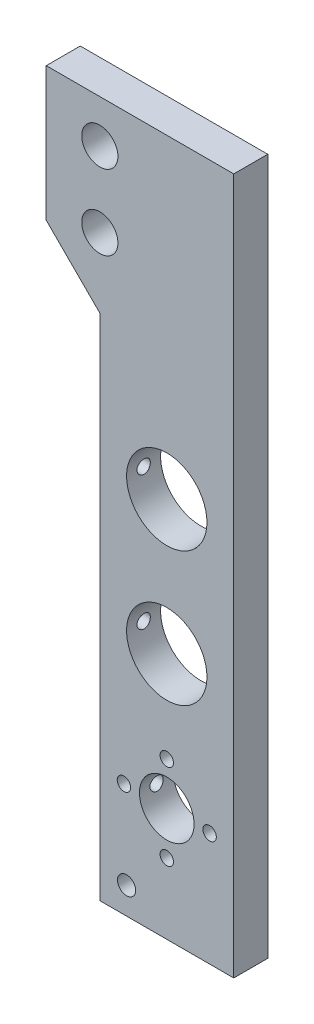
ISO-10303-21;
HEADER;
FILE_DESCRIPTION(('STEP AP214'),'2;1');
FILE_NAME('part.step','',(''),(''),'','','');
FILE_SCHEMA(('AUTOMOTIVE_DESIGN { 1 0 10303 214 1 1 1 1 }'));
ENDSEC;
DATA;
#1=APPLICATION_CONTEXT('core data for automotive mechanical design processes');
#2=APPLICATION_PROTOCOL_DEFINITION('international standard','automotive_design',2000,#1);
#3=PRODUCT_CONTEXT('',#1,'mechanical');
#4=PRODUCT('Part','Part','',(#3));
#5=PRODUCT_RELATED_PRODUCT_CATEGORY('part','',(#4));
#6=PRODUCT_DEFINITION_FORMATION('','',#4);
#7=PRODUCT_DEFINITION_CONTEXT('part definition',#1,'design');
#8=PRODUCT_DEFINITION('design','',#6,#7);
#9=PRODUCT_DEFINITION_SHAPE('','',#8);
#10=(LENGTH_UNIT() NAMED_UNIT(*) SI_UNIT(.MILLI.,.METRE.));
#11=(NAMED_UNIT(*) PLANE_ANGLE_UNIT() SI_UNIT($,.RADIAN.));
#12=(NAMED_UNIT(*) SI_UNIT($,.STERADIAN.) SOLID_ANGLE_UNIT());
#13=UNCERTAINTY_MEASURE_WITH_UNIT(LENGTH_MEASURE(1.E-05),#10,'distance_accuracy_value','');
#14=(GEOMETRIC_REPRESENTATION_CONTEXT(3) GLOBAL_UNCERTAINTY_ASSIGNED_CONTEXT((#13)) GLOBAL_UNIT_ASSIGNED_CONTEXT((#10,
#11,#12)) REPRESENTATION_CONTEXT('',''));
#15=CARTESIAN_POINT('',(0.,0.,0.));
#16=DIRECTION('',(0.,0.,1.));
#17=DIRECTION('',(1.,0.,0.));
#18=AXIS2_PLACEMENT_3D('',#15,#16,#17);
#19=CARTESIAN_POINT('',(0.,0.,6.35));
#20=DIRECTION('',(0.,0.,-1.));
#21=DIRECTION('',(-1.,0.,0.));
#22=AXIS2_PLACEMENT_3D('',#19,#20,#21);
#23=PLANE('',#22);
#24=CARTESIAN_POINT('',(-7.5,-16.15,6.35));
#25=DIRECTION('',(0.,0.,1.));
#26=DIRECTION('',(1.,0.,0.));
#27=AXIS2_PLACEMENT_3D('',#24,#25,#26);
#28=CIRCLE('',#27,1.69999999999999);
#29=CARTESIAN_POINT('',(-5.80000000000001,-16.15,6.35));
#30=VERTEX_POINT('',#29);
#31=EDGE_CURVE('E265',#30,#30,#28,.T.);
#32=ORIENTED_EDGE('',*,*,#31,.F.);
#33=EDGE_LOOP('',(#32));
#34=FACE_BOUND('',#33,.T.);
#35=CARTESIAN_POINT('',(0.,8.,6.35));
#36=DIRECTION('',(0.,0.,1.));
#37=DIRECTION('',(1.,0.,0.));
#38=AXIS2_PLACEMENT_3D('',#35,#36,#37);
#39=CIRCLE('',#38,1.25);
#40=CARTESIAN_POINT('',(1.25,8.,6.35));
#41=VERTEX_POINT('',#40);
#42=EDGE_CURVE('E259',#41,#41,#39,.T.);
#43=ORIENTED_EDGE('',*,*,#42,.F.);
#44=EDGE_LOOP('',(#43));
#45=FACE_BOUND('',#44,.T.);
#46=CARTESIAN_POINT('',(8.,0.,6.35));
#47=DIRECTION('',(0.,0.,1.));
#48=DIRECTION('',(1.,0.,0.));
#49=AXIS2_PLACEMENT_3D('',#46,#47,#48);
#50=CIRCLE('',#49,1.25);
#51=CARTESIAN_POINT('',(9.25,0.,6.35));
#52=VERTEX_POINT('',#51);
#53=EDGE_CURVE('E253',#52,#52,#50,.T.);
#54=ORIENTED_EDGE('',*,*,#53,.F.);
#55=EDGE_LOOP('',(#54));
#56=FACE_BOUND('',#55,.T.);
#57=CARTESIAN_POINT('',(0.,-8.,6.35));
#58=DIRECTION('',(0.,0.,1.));
#59=DIRECTION('',(1.,0.,0.));
#60=AXIS2_PLACEMENT_3D('',#57,#58,#59);
#61=CIRCLE('',#60,1.25);
#62=CARTESIAN_POINT('',(1.25,-8.,6.35));
#63=VERTEX_POINT('',#62);
#64=EDGE_CURVE('E247',#63,#63,#61,.T.);
#65=ORIENTED_EDGE('',*,*,#64,.F.);
#66=EDGE_LOOP('',(#65));
#67=FACE_BOUND('',#66,.T.);
#68=CARTESIAN_POINT('',(-12.5,86.85,6.35));
#69=DIRECTION('',(0.,0.,1.));
#70=DIRECTION('',(1.,0.,0.));
#71=AXIS2_PLACEMENT_3D('',#68,#69,#70);
#72=CIRCLE('',#71,3.3782);
#73=CARTESIAN_POINT('',(-9.1218,86.85,6.35));
#74=VERTEX_POINT('',#73);
#75=EDGE_CURVE('E235',#74,#74,#72,.T.);
#76=ORIENTED_EDGE('',*,*,#75,.F.);
#77=EDGE_LOOP('',(#76));
#78=FACE_BOUND('',#77,.T.);
#79=DIRECTION('',(-1.,0.,0.));
#80=VECTOR('',#79,1.);
#81=CARTESIAN_POINT('',(-12.5,108.85,6.35));
#82=LINE('',#81,#80);
#83=CARTESIAN_POINT('',(12.5,108.85,6.35));
#84=VERTEX_POINT('',#83);
#85=CARTESIAN_POINT('',(-22.5,108.85,6.35));
#86=VERTEX_POINT('',#85);
#87=EDGE_CURVE('E172',#84,#86,#82,.T.);
#88=ORIENTED_EDGE('',*,*,#87,.T.);
#89=DIRECTION('',(0.,-1.,0.));
#90=VECTOR('',#89,1.);
#91=CARTESIAN_POINT('',(-22.5,83.8500000000001,6.35));
#92=LINE('',#91,#90);
#93=CARTESIAN_POINT('',(-22.5,83.8500000000001,6.35));
#94=VERTEX_POINT('',#93);
#95=EDGE_CURVE('E213',#86,#94,#92,.T.);
#96=ORIENTED_EDGE('',*,*,#95,.T.);
#97=DIRECTION('',(0.707106781186543,-0.707106781186552,0.));
#98=VECTOR('',#97,1.);
#99=CARTESIAN_POINT('',(-12.5,73.85,6.35));
#100=LINE('',#99,#98);
#101=CARTESIAN_POINT('',(-12.5,73.85,6.35));
#102=VERTEX_POINT('',#101);
#103=EDGE_CURVE('E211',#94,#102,#100,.T.);
#104=ORIENTED_EDGE('',*,*,#103,.T.);
#105=DIRECTION('',(0.,-1.,0.));
#106=VECTOR('',#105,1.);
#107=CARTESIAN_POINT('',(-12.5,-21.15,6.35));
#108=LINE('',#107,#106);
#109=CARTESIAN_POINT('',(-12.5,-21.15,6.35));
#110=VERTEX_POINT('',#109);
#111=EDGE_CURVE('E175',#102,#110,#108,.T.);
#112=ORIENTED_EDGE('',*,*,#111,.T.);
#113=DIRECTION('',(1.,0.,0.));
#114=VECTOR('',#113,1.);
#115=CARTESIAN_POINT('',(-12.5,-21.15,6.35));
#116=LINE('',#115,#114);
#117=CARTESIAN_POINT('',(12.5,-21.15,6.35));
#118=VERTEX_POINT('',#117);
#119=EDGE_CURVE('E186',#110,#118,#116,.T.);
#120=ORIENTED_EDGE('',*,*,#119,.T.);
#121=DIRECTION('',(0.,1.,0.));
#122=VECTOR('',#121,1.);
#123=CARTESIAN_POINT('',(12.5,-21.15,6.35));
#124=LINE('',#123,#122);
#125=EDGE_CURVE('E184',#118,#84,#124,.T.);
#126=ORIENTED_EDGE('',*,*,#125,.T.);
#127=EDGE_LOOP('',(#88,#96,#104,#112,#120,#126));
#128=FACE_BOUND('',#127,.T.);
#129=CARTESIAN_POINT('',(0.,0.,6.35));
#130=DIRECTION('',(0.,0.,1.));
#131=DIRECTION('',(1.,0.,0.));
#132=AXIS2_PLACEMENT_3D('',#129,#130,#131);
#133=CIRCLE('',#132,5.1);
#134=CARTESIAN_POINT('',(5.1,0.,6.35));
#135=VERTEX_POINT('',#134);
#136=EDGE_CURVE('E182',#135,#135,#133,.T.);
#137=ORIENTED_EDGE('',*,*,#136,.F.);
#138=EDGE_LOOP('',(#137));
#139=FACE_BOUND('',#138,.T.);
#140=CARTESIAN_POINT('',(0.,25.,6.35));
#141=DIRECTION('',(0.,0.,1.));
#142=DIRECTION('',(1.,0.,0.));
#143=AXIS2_PLACEMENT_3D('',#140,#141,#142);
#144=CIRCLE('',#143,7.5);
#145=CARTESIAN_POINT('',(7.5,25.,6.35));
#146=VERTEX_POINT('',#145);
#147=EDGE_CURVE('E192',#146,#146,#144,.T.);
#148=ORIENTED_EDGE('',*,*,#147,.F.);
#149=EDGE_LOOP('',(#148));
#150=FACE_BOUND('',#149,.T.);
#151=CARTESIAN_POINT('',(0.,50.,6.35));
#152=DIRECTION('',(0.,0.,1.));
#153=DIRECTION('',(1.,0.,0.));
#154=AXIS2_PLACEMENT_3D('',#151,#152,#153);
#155=CIRCLE('',#154,7.5);
#156=CARTESIAN_POINT('',(7.5,50.,6.35));
#157=VERTEX_POINT('',#156);
#158=EDGE_CURVE('E198',#157,#157,#155,.T.);
#159=ORIENTED_EDGE('',*,*,#158,.F.);
#160=EDGE_LOOP('',(#159));
#161=FACE_BOUND('',#160,.T.);
#162=CARTESIAN_POINT('',(-12.5,100.85,6.35));
#163=DIRECTION('',(0.,0.,1.));
#164=DIRECTION('',(1.,0.,0.));
#165=AXIS2_PLACEMENT_3D('',#162,#163,#164);
#166=CIRCLE('',#165,3.3782);
#167=CARTESIAN_POINT('',(-9.1218,100.85,6.35));
#168=VERTEX_POINT('',#167);
#169=EDGE_CURVE('E229',#168,#168,#166,.T.);
#170=ORIENTED_EDGE('',*,*,#169,.F.);
#171=EDGE_LOOP('',(#170));
#172=FACE_BOUND('',#171,.T.);
#173=CARTESIAN_POINT('',(-8.,0.,6.35));
#174=DIRECTION('',(0.,0.,1.));
#175=DIRECTION('',(1.,0.,0.));
#176=AXIS2_PLACEMENT_3D('',#173,#174,#175);
#177=CIRCLE('',#176,1.25);
#178=CARTESIAN_POINT('',(-6.75,0.,6.35));
#179=VERTEX_POINT('',#178);
#180=EDGE_CURVE('E241',#179,#179,#177,.T.);
#181=ORIENTED_EDGE('',*,*,#180,.F.);
#182=EDGE_LOOP('',(#181));
#183=FACE_BOUND('',#182,.T.);
#184=ADVANCED_FACE('F45',(#34,#45,#56,#67,#78,#128,#139,#150,#161,#172,#183),#23,.F.);
#185=CARTESIAN_POINT('',(-12.5,0.,3.175));
#186=DIRECTION('',(-1.,0.,0.));
#187=DIRECTION('',(0.,0.,1.));
#188=AXIS2_PLACEMENT_3D('',#185,#186,#187);
#189=CYLINDRICAL_SURFACE('',#188,1.24999999999999);
#190=CARTESIAN_POINT('',(-12.5,0.,3.175));
#191=DIRECTION('',(-1.,0.,0.));
#192=DIRECTION('',(0.,0.,1.));
#193=AXIS2_PLACEMENT_3D('',#190,#191,#192);
#194=CIRCLE('',#193,1.24999999999999);
#195=CARTESIAN_POINT('',(-12.5,0.,4.42499999999999));
#196=VERTEX_POINT('',#195);
#197=EDGE_CURVE('E127',#196,#196,#194,.T.);
#198=ORIENTED_EDGE('',*,*,#197,.T.);
#199=EDGE_LOOP('',(#198));
#200=FACE_BOUND('',#199,.T.);
#201=CARTESIAN_POINT('',(-8.,0.,3.175));
#202=DIRECTION('',(-0.707106781186547,0.,-0.707106781186547));
#203=DIRECTION('',(-0.707106781186547,0.,0.707106781186547));
#204=AXIS2_PLACEMENT_3D('',#201,#202,#203);
#205=ELLIPSE('',#204,1.76776695296636,1.25);
#206=CARTESIAN_POINT('',(-8.,1.25,3.175));
#207=VERTEX_POINT('',#206);
#208=CARTESIAN_POINT('',(-8.,-1.25,3.175));
#209=VERTEX_POINT('',#208);
#210=EDGE_CURVE('E58',#207,#209,#205,.F.);
#211=ORIENTED_EDGE('',*,*,#210,.T.);
#212=CARTESIAN_POINT('',(-8.,0.,3.175));
#213=DIRECTION('',(-0.707106781186547,0.,0.707106781186547));
#214=DIRECTION('',(-0.707106781186547,0.,-0.707106781186547));
#215=AXIS2_PLACEMENT_3D('',#212,#213,#214);
#216=ELLIPSE('',#215,1.76776695296636,1.25);
#217=EDGE_CURVE('E11',#209,#207,#216,.F.);
#218=ORIENTED_EDGE('',*,*,#217,.T.);
#219=EDGE_LOOP('',(#211,#218));
#220=FACE_BOUND('',#219,.T.);
#221=ADVANCED_FACE('F114',(#200,#220),#189,.F.);
#222=CARTESIAN_POINT('',(0.,0.,0.));
#223=DIRECTION('',(0.,0.,-1.));
#224=DIRECTION('',(-1.,0.,0.));
#225=AXIS2_PLACEMENT_3D('',#222,#223,#224);
#226=PLANE('',#225);
#227=CARTESIAN_POINT('',(-7.5,-16.15,0.));
#228=DIRECTION('',(0.,0.,1.));
#229=DIRECTION('',(1.,0.,0.));
#230=AXIS2_PLACEMENT_3D('',#227,#228,#229);
#231=CIRCLE('',#230,1.7);
#232=CARTESIAN_POINT('',(-5.8,-16.15,0.));
#233=VERTEX_POINT('',#232);
#234=EDGE_CURVE('E262',#233,#233,#231,.T.);
#235=ORIENTED_EDGE('',*,*,#234,.T.);
#236=EDGE_LOOP('',(#235));
#237=FACE_BOUND('',#236,.T.);
#238=CARTESIAN_POINT('',(0.,8.,0.));
#239=DIRECTION('',(0.,0.,1.));
#240=DIRECTION('',(1.,0.,0.));
#241=AXIS2_PLACEMENT_3D('',#238,#239,#240);
#242=CIRCLE('',#241,1.25);
#243=CARTESIAN_POINT('',(1.25,8.,0.));
#244=VERTEX_POINT('',#243);
#245=EDGE_CURVE('E256',#244,#244,#242,.T.);
#246=ORIENTED_EDGE('',*,*,#245,.T.);
#247=EDGE_LOOP('',(#246));
#248=FACE_BOUND('',#247,.T.);
#249=CARTESIAN_POINT('',(8.,0.,0.));
#250=DIRECTION('',(0.,0.,1.));
#251=DIRECTION('',(1.,0.,0.));
#252=AXIS2_PLACEMENT_3D('',#249,#250,#251);
#253=CIRCLE('',#252,1.25);
#254=CARTESIAN_POINT('',(9.25,0.,0.));
#255=VERTEX_POINT('',#254);
#256=EDGE_CURVE('E250',#255,#255,#253,.T.);
#257=ORIENTED_EDGE('',*,*,#256,.T.);
#258=EDGE_LOOP('',(#257));
#259=FACE_BOUND('',#258,.T.);
#260=CARTESIAN_POINT('',(0.,-8.,0.));
#261=DIRECTION('',(0.,0.,1.));
#262=DIRECTION('',(1.,0.,0.));
#263=AXIS2_PLACEMENT_3D('',#260,#261,#262);
#264=CIRCLE('',#263,1.25);
#265=CARTESIAN_POINT('',(1.25,-8.,0.));
#266=VERTEX_POINT('',#265);
#267=EDGE_CURVE('E244',#266,#266,#264,.T.);
#268=ORIENTED_EDGE('',*,*,#267,.T.);
#269=EDGE_LOOP('',(#268));
#270=FACE_BOUND('',#269,.T.);
#271=CARTESIAN_POINT('',(-8.,0.,0.));
#272=DIRECTION('',(0.,0.,1.));
#273=DIRECTION('',(1.,0.,0.));
#274=AXIS2_PLACEMENT_3D('',#271,#272,#273);
#275=CIRCLE('',#274,1.25);
#276=CARTESIAN_POINT('',(-6.75,0.,0.));
#277=VERTEX_POINT('',#276);
#278=EDGE_CURVE('E238',#277,#277,#275,.T.);
#279=ORIENTED_EDGE('',*,*,#278,.T.);
#280=EDGE_LOOP('',(#279));
#281=FACE_BOUND('',#280,.T.);
#282=CARTESIAN_POINT('',(-12.5,86.85,0.));
#283=DIRECTION('',(0.,0.,1.));
#284=DIRECTION('',(1.,0.,0.));
#285=AXIS2_PLACEMENT_3D('',#282,#283,#284);
#286=CIRCLE('',#285,3.3782);
#287=CARTESIAN_POINT('',(-9.1218,86.85,0.));
#288=VERTEX_POINT('',#287);
#289=EDGE_CURVE('E232',#288,#288,#286,.T.);
#290=ORIENTED_EDGE('',*,*,#289,.T.);
#291=EDGE_LOOP('',(#290));
#292=FACE_BOUND('',#291,.T.);
#293=CARTESIAN_POINT('',(-12.5,100.85,0.));
#294=DIRECTION('',(0.,0.,1.));
#295=DIRECTION('',(1.,0.,0.));
#296=AXIS2_PLACEMENT_3D('',#293,#294,#295);
#297=CIRCLE('',#296,3.3782);
#298=CARTESIAN_POINT('',(-9.1218,100.85,0.));
#299=VERTEX_POINT('',#298);
#300=EDGE_CURVE('E225',#299,#299,#297,.T.);
#301=ORIENTED_EDGE('',*,*,#300,.T.);
#302=EDGE_LOOP('',(#301));
#303=FACE_BOUND('',#302,.T.);
#304=CARTESIAN_POINT('',(0.,25.,0.));
#305=DIRECTION('',(0.,0.,1.));
#306=DIRECTION('',(1.,0.,0.));
#307=AXIS2_PLACEMENT_3D('',#304,#305,#306);
#308=CIRCLE('',#307,7.5);
#309=CARTESIAN_POINT('',(7.5,25.,0.));
#310=VERTEX_POINT('',#309);
#311=EDGE_CURVE('E195',#310,#310,#308,.T.);
#312=ORIENTED_EDGE('',*,*,#311,.T.);
#313=EDGE_LOOP('',(#312));
#314=FACE_BOUND('',#313,.T.);
#315=DIRECTION('',(0.,-1.,0.));
#316=VECTOR('',#315,1.);
#317=CARTESIAN_POINT('',(-12.5,-21.15,0.));
#318=LINE('',#317,#316);
#319=CARTESIAN_POINT('',(-12.5,73.85,0.));
#320=VERTEX_POINT('',#319);
#321=CARTESIAN_POINT('',(-12.5,-21.15,0.));
#322=VERTEX_POINT('',#321);
#323=EDGE_CURVE('E180',#320,#322,#318,.T.);
#324=ORIENTED_EDGE('',*,*,#323,.F.);
#325=DIRECTION('',(-0.707106781186543,0.707106781186552,0.));
#326=VECTOR('',#325,1.);
#327=CARTESIAN_POINT('',(-12.5,73.85,0.));
#328=LINE('',#327,#326);
#329=CARTESIAN_POINT('',(-22.5,83.8500000000001,0.));
#330=VERTEX_POINT('',#329);
#331=EDGE_CURVE('E66',#320,#330,#328,.T.);
#332=ORIENTED_EDGE('',*,*,#331,.T.);
#333=DIRECTION('',(0.,1.,0.));
#334=VECTOR('',#333,1.);
#335=CARTESIAN_POINT('',(-22.5,83.8500000000001,0.));
#336=LINE('',#335,#334);
#337=CARTESIAN_POINT('',(-22.5,108.85,0.));
#338=VERTEX_POINT('',#337);
#339=EDGE_CURVE('E217',#330,#338,#336,.T.);
#340=ORIENTED_EDGE('',*,*,#339,.T.);
#341=DIRECTION('',(-1.,0.,0.));
#342=VECTOR('',#341,1.);
#343=CARTESIAN_POINT('',(-12.5,108.85,0.));
#344=LINE('',#343,#342);
#345=CARTESIAN_POINT('',(12.5,108.85,0.));
#346=VERTEX_POINT('',#345);
#347=EDGE_CURVE('E173',#346,#338,#344,.T.);
#348=ORIENTED_EDGE('',*,*,#347,.F.);
#349=DIRECTION('',(0.,1.,0.));
#350=VECTOR('',#349,1.);
#351=CARTESIAN_POINT('',(12.5,-21.15,0.));
#352=LINE('',#351,#350);
#353=CARTESIAN_POINT('',(12.5,-21.15,0.));
#354=VERTEX_POINT('',#353);
#355=EDGE_CURVE('E176',#354,#346,#352,.T.);
#356=ORIENTED_EDGE('',*,*,#355,.F.);
#357=DIRECTION('',(1.,0.,0.));
#358=VECTOR('',#357,1.);
#359=CARTESIAN_POINT('',(-12.5,-21.15,0.));
#360=LINE('',#359,#358);
#361=EDGE_CURVE('E178',#322,#354,#360,.T.);
#362=ORIENTED_EDGE('',*,*,#361,.F.);
#363=EDGE_LOOP('',(#324,#332,#340,#348,#356,#362));
#364=FACE_BOUND('',#363,.T.);
#365=CARTESIAN_POINT('',(0.,0.,0.));
#366=DIRECTION('',(0.,0.,1.));
#367=DIRECTION('',(1.,0.,0.));
#368=AXIS2_PLACEMENT_3D('',#365,#366,#367);
#369=CIRCLE('',#368,5.1);
#370=CARTESIAN_POINT('',(5.1,0.,0.));
#371=VERTEX_POINT('',#370);
#372=EDGE_CURVE('E189',#371,#371,#369,.T.);
#373=ORIENTED_EDGE('',*,*,#372,.T.);
#374=EDGE_LOOP('',(#373));
#375=FACE_BOUND('',#374,.T.);
#376=CARTESIAN_POINT('',(0.,50.,0.));
#377=DIRECTION('',(0.,0.,1.));
#378=DIRECTION('',(1.,0.,0.));
#379=AXIS2_PLACEMENT_3D('',#376,#377,#378);
#380=CIRCLE('',#379,7.5);
#381=CARTESIAN_POINT('',(7.5,50.,0.));
#382=VERTEX_POINT('',#381);
#383=EDGE_CURVE('E162',#382,#382,#380,.T.);
#384=ORIENTED_EDGE('',*,*,#383,.T.);
#385=EDGE_LOOP('',(#384));
#386=FACE_BOUND('',#385,.T.);
#387=ADVANCED_FACE('F328',(#237,#248,#259,#270,#281,#292,#303,#314,#364,#375,#386),#226,.T.);
#388=CARTESIAN_POINT('',(-12.5,-21.15,6.35));
#389=DIRECTION('',(1.,0.,0.));
#390=DIRECTION('',(0.,0.,-1.));
#391=AXIS2_PLACEMENT_3D('',#388,#389,#390);
#392=PLANE('',#391);
#393=ORIENTED_EDGE('',*,*,#197,.F.);
#394=EDGE_LOOP('',(#393));
#395=FACE_BOUND('',#394,.T.);
#396=CARTESIAN_POINT('',(-12.5,25.,3.175));
#397=DIRECTION('',(-1.,0.,0.));
#398=DIRECTION('',(0.,0.,1.));
#399=AXIS2_PLACEMENT_3D('',#396,#397,#398);
#400=CIRCLE('',#399,1.24999999999999);
#401=CARTESIAN_POINT('',(-12.5,25.,4.42499999999999));
#402=VERTEX_POINT('',#401);
#403=EDGE_CURVE('E126',#402,#402,#400,.T.);
#404=ORIENTED_EDGE('',*,*,#403,.F.);
#405=EDGE_LOOP('',(#404));
#406=FACE_BOUND('',#405,.T.);
#407=CARTESIAN_POINT('',(-12.5,50.,3.175));
#408=DIRECTION('',(-1.,0.,0.));
#409=DIRECTION('',(0.,0.,1.));
#410=AXIS2_PLACEMENT_3D('',#407,#408,#409);
#411=CIRCLE('',#410,1.24999999999999);
#412=CARTESIAN_POINT('',(-12.5,50.,4.42499999999999));
#413=VERTEX_POINT('',#412);
#414=EDGE_CURVE('E163',#413,#413,#411,.T.);
#415=ORIENTED_EDGE('',*,*,#414,.F.);
#416=EDGE_LOOP('',(#415));
#417=FACE_BOUND('',#416,.T.);
#418=ORIENTED_EDGE('',*,*,#111,.F.);
#419=DIRECTION('',(0.,0.,-1.));
#420=VECTOR('',#419,1.);
#421=CARTESIAN_POINT('',(-12.5,73.85,42.7505494464026));
#422=LINE('',#421,#420);
#423=EDGE_CURVE('E214',#102,#320,#422,.T.);
#424=ORIENTED_EDGE('',*,*,#423,.T.);
#425=ORIENTED_EDGE('',*,*,#323,.T.);
#426=DIRECTION('',(0.,0.,-1.));
#427=VECTOR('',#426,1.);
#428=CARTESIAN_POINT('',(-12.5,-21.15,6.35));
#429=LINE('',#428,#427);
#430=EDGE_CURVE('E112',#110,#322,#429,.T.);
#431=ORIENTED_EDGE('',*,*,#430,.F.);
#432=EDGE_LOOP('',(#418,#424,#425,#431));
#433=FACE_BOUND('',#432,.T.);
#434=ADVANCED_FACE('F47',(#395,#406,#417,#433),#392,.F.);
#435=CARTESIAN_POINT('',(-12.5,-21.15,6.35));
#436=DIRECTION('',(0.,1.,0.));
#437=DIRECTION('',(-1.,0.,0.));
#438=AXIS2_PLACEMENT_3D('',#435,#436,#437);
#439=PLANE('',#438);
#440=ORIENTED_EDGE('',*,*,#361,.T.);
#441=DIRECTION('',(0.,0.,-1.));
#442=VECTOR('',#441,1.);
#443=CARTESIAN_POINT('',(12.5,-21.15,6.35));
#444=LINE('',#443,#442);
#445=EDGE_CURVE('E166',#118,#354,#444,.T.);
#446=ORIENTED_EDGE('',*,*,#445,.F.);
#447=ORIENTED_EDGE('',*,*,#119,.F.);
#448=ORIENTED_EDGE('',*,*,#430,.T.);
#449=EDGE_LOOP('',(#440,#446,#447,#448));
#450=FACE_BOUND('',#449,.T.);
#451=ADVANCED_FACE('F337',(#450),#439,.F.);
#452=CARTESIAN_POINT('',(12.5,-21.15,6.35));
#453=DIRECTION('',(-1.,0.,0.));
#454=DIRECTION('',(0.,-1.,0.));
#455=AXIS2_PLACEMENT_3D('',#452,#453,#454);
#456=PLANE('',#455);
#457=ORIENTED_EDGE('',*,*,#355,.T.);
#458=DIRECTION('',(0.,0.,-1.));
#459=VECTOR('',#458,1.);
#460=CARTESIAN_POINT('',(12.5,108.85,6.35));
#461=LINE('',#460,#459);
#462=EDGE_CURVE('E169',#84,#346,#461,.T.);
#463=ORIENTED_EDGE('',*,*,#462,.F.);
#464=ORIENTED_EDGE('',*,*,#125,.F.);
#465=ORIENTED_EDGE('',*,*,#445,.T.);
#466=EDGE_LOOP('',(#457,#463,#464,#465));
#467=FACE_BOUND('',#466,.T.);
#468=ADVANCED_FACE('F340',(#467),#456,.F.);
#469=CARTESIAN_POINT('',(-12.5,108.85,6.35));
#470=DIRECTION('',(0.,-1.,0.));
#471=DIRECTION('',(0.,0.,-1.));
#472=AXIS2_PLACEMENT_3D('',#469,#470,#471);
#473=PLANE('',#472);
#474=ORIENTED_EDGE('',*,*,#347,.T.);
#475=DIRECTION('',(0.,0.,-1.));
#476=VECTOR('',#475,1.);
#477=CARTESIAN_POINT('',(-22.5,108.85,42.7505494464026));
#478=LINE('',#477,#476);
#479=EDGE_CURVE('E219',#86,#338,#478,.T.);
#480=ORIENTED_EDGE('',*,*,#479,.F.);
#481=ORIENTED_EDGE('',*,*,#87,.F.);
#482=ORIENTED_EDGE('',*,*,#462,.T.);
#483=EDGE_LOOP('',(#474,#480,#481,#482));
#484=FACE_BOUND('',#483,.T.);
#485=ADVANCED_FACE('F322',(#484),#473,.F.);
#486=CARTESIAN_POINT('',(0.,0.,6.35));
#487=DIRECTION('',(0.,0.,-1.));
#488=DIRECTION('',(-1.,0.,0.));
#489=AXIS2_PLACEMENT_3D('',#486,#487,#488);
#490=CYLINDRICAL_SURFACE('',#489,5.1);
#491=CARTESIAN_POINT('',(-5.1,0.,4.42499999999999));
#492=CARTESIAN_POINT('',(-5.09999880434979,-0.0691070684996923,4.42499798348911));
#493=CARTESIAN_POINT('',(-5.09858131536654,-0.138236944418446,4.4192497622837));
#494=CARTESIAN_POINT('',(-5.09306394414274,-0.27451832854268,4.39644143704133));
#495=CARTESIAN_POINT('',(-5.08896247642349,-0.341668642864989,4.37937464682424));
#496=CARTESIAN_POINT('',(-5.07853173481307,-0.472002952228089,4.33450744461656));
#497=CARTESIAN_POINT('',(-5.07220508043732,-0.5351915084831,4.30671964980311));
#498=CARTESIAN_POINT('',(-5.0579992354546,-0.656009783807283,4.24124292525055));
#499=CARTESIAN_POINT('',(-5.05012000732641,-0.713639368482087,4.2035537562166));
#500=CARTESIAN_POINT('',(-5.03349079831523,-0.822848252966835,4.11855356167071));
#501=CARTESIAN_POINT('',(-5.02472780422834,-0.874301457474932,4.07108306460641));
#502=CARTESIAN_POINT('',(-5.00740600303306,-0.968601490513414,3.96820930927441));
#503=CARTESIAN_POINT('',(-4.99884721820992,-1.01144738348376,3.91280518979219));
#504=CARTESIAN_POINT('',(-4.98277220490616,-1.0879035028578,3.7946655484121));
#505=CARTESIAN_POINT('',(-4.9752725239875,-1.1213738013313,3.73183701406763));
#506=CARTESIAN_POINT('',(-4.96235417524496,-1.17722916418204,3.60123185816075));
#507=CARTESIAN_POINT('',(-4.95693518890104,-1.1996159254181,3.53345599584475));
#508=CARTESIAN_POINT('',(-4.94892534918552,-1.23224077227211,3.39626367528794));
#509=CARTESIAN_POINT('',(-4.94628192270404,-1.24270502580645,3.32690414045871));
#510=CARTESIAN_POINT('',(-4.94396505119134,-1.2518920997985,3.18736752907348));
#511=CARTESIAN_POINT('',(-4.94429114286616,-1.25061675182797,3.11719058175357));
#512=CARTESIAN_POINT('',(-4.94782914866117,-1.23654152995141,2.97973582774668));
#513=CARTESIAN_POINT('',(-4.9509738595344,-1.22401001756151,2.91242854252081));
#514=CARTESIAN_POINT('',(-4.95968781619626,-1.18820580162089,2.78090195017533));
#515=CARTESIAN_POINT('',(-4.96525722871731,-1.1649323594044,2.71668285574965));
#516=CARTESIAN_POINT('',(-4.97825548132943,-1.10807335491485,2.5924302741977));
#517=CARTESIAN_POINT('',(-4.98570192341189,-1.07438945055791,2.53244370782828));
#518=CARTESIAN_POINT('',(-5.00160513396375,-0.997734518212738,2.41887753755934));
#519=CARTESIAN_POINT('',(-5.01006207277567,-0.954761923411034,2.3652990169383));
#520=CARTESIAN_POINT('',(-5.02731725106061,-0.859354317594715,2.26453072281943));
#521=CARTESIAN_POINT('',(-5.03611849726846,-0.80669254516649,2.21755590209154));
#522=CARTESIAN_POINT('',(-5.05286158733432,-0.69413417805451,2.13306440738741));
#523=CARTESIAN_POINT('',(-5.06080340690474,-0.634237379008398,2.09554800066832));
#524=CARTESIAN_POINT('',(-5.07496988361232,-0.508609859612946,2.03096369665686));
#525=CARTESIAN_POINT('',(-5.08118896830561,-0.442861095774586,2.00392959578838));
#526=CARTESIAN_POINT('',(-5.09116862078237,-0.307566171137273,1.96135681179118));
#527=CARTESIAN_POINT('',(-5.09492964005615,-0.238020710248732,1.94581601753633));
#528=CARTESIAN_POINT('',(-5.09950300203926,-0.098945314274633,1.92699667883518));
#529=CARTESIAN_POINT('',(-5.10038575477826,-0.0294572667514421,1.92342526946549));
#530=CARTESIAN_POINT('',(-5.09930312829893,0.109123373763241,1.92784439063548));
#531=CARTESIAN_POINT('',(-5.09733799487026,0.178216000365266,1.93583392339636));
#532=CARTESIAN_POINT('',(-5.09082541313749,0.313034626367913,1.96290645272339));
#533=CARTESIAN_POINT('',(-5.08631494103106,0.378794452619993,1.9818306926693));
#534=CARTESIAN_POINT('',(-5.07521932825952,0.506203454443046,2.03005495923954));
#535=CARTESIAN_POINT('',(-5.06863398290122,0.567852223717139,2.05935600960629));
#536=CARTESIAN_POINT('',(-5.05394953642363,0.686461955962982,2.12807669338878));
#537=CARTESIAN_POINT('',(-5.04582634854577,0.74332405912619,2.16766168645971));
#538=CARTESIAN_POINT('',(-5.02900694161717,0.849702675725454,2.25561419666595));
#539=CARTESIAN_POINT('',(-5.02031062787397,0.899217970897997,2.30398316742856));
#540=CARTESIAN_POINT('',(-5.00307328773869,0.990696382723894,2.40948809131636));
#541=CARTESIAN_POINT('',(-4.99454072619954,1.03245444963732,2.46680350705719));
#542=CARTESIAN_POINT('',(-4.9788261359557,1.10575822346969,2.58780212648628));
#543=CARTESIAN_POINT('',(-4.97164404691533,1.13730438667597,2.65148504549588));
#544=CARTESIAN_POINT('',(-4.95952136957446,1.18905616976229,2.78306601778779));
#545=CARTESIAN_POINT('',(-4.95456754355924,1.20932893763628,2.85093637844542));
#546=CARTESIAN_POINT('',(-4.94744732527486,1.2381394598066,2.98926126330338));
#547=CARTESIAN_POINT('',(-4.94528035148441,1.24667966231571,3.05971524523299));
#548=CARTESIAN_POINT('',(-4.94402228162178,1.25165848529287,3.19912423175996));
#549=CARTESIAN_POINT('',(-4.94484800382851,1.2484243607539,3.26806698903094));
#550=CARTESIAN_POINT('',(-4.94929065899866,1.23069244506029,3.40439209851615));
#551=CARTESIAN_POINT('',(-4.952907540025,1.21619486349272,3.47177447974137));
#552=CARTESIAN_POINT('',(-4.96247954352293,1.17652305640476,3.60272609531758));
#553=CARTESIAN_POINT('',(-4.9684217046624,1.1514079526715,3.66631425279892));
#554=CARTESIAN_POINT('',(-4.98197703107667,1.09126121671283,3.78841874530863));
#555=CARTESIAN_POINT('',(-4.98959041906046,1.05622826264648,3.84693440292061));
#556=CARTESIAN_POINT('',(-5.00586943046763,0.976204563183662,3.95881959942418));
#557=CARTESIAN_POINT('',(-5.01455668828479,0.930985706061677,4.0120228663445));
#558=CARTESIAN_POINT('',(-5.03187294207899,0.832321323332238,4.1101927865744));
#559=CARTESIAN_POINT('',(-5.04050192381697,0.778873858036758,4.15515749236229));
#560=CARTESIAN_POINT('',(-5.05690655619084,0.664158652901532,4.23632692040344));
#561=CARTESIAN_POINT('',(-5.0646649532915,0.602772094361998,4.27236745852572));
#562=CARTESIAN_POINT('',(-5.07827391506525,0.474628080310967,4.3335600387649));
#563=CARTESIAN_POINT('',(-5.08412588542531,0.407874627519969,4.35872010800248));
#564=CARTESIAN_POINT('',(-5.09236742668302,0.284339168519939,4.39357703254263));
#565=CARTESIAN_POINT('',(-5.09521030945108,0.228160130166595,4.40533568875331));
#566=CARTESIAN_POINT('',(-5.09902702732158,0.114659241633676,4.42104773842207));
#567=CARTESIAN_POINT('',(-5.10000099201949,0.0573374709725586,4.4250016730797));
#568=CARTESIAN_POINT('',(-5.1,0.,4.42499999999999));
#569=B_SPLINE_CURVE_WITH_KNOTS('',3,(#491,#492,#493,#494,#495,#496,#497,#498,#499,#500,#501,
#502,#503,#504,#505,#506,#507,#508,#509,#510,#511,#512,#513,#514,#515,#516,#517,#518,#519,#520,
#521,#522,#523,#524,#525,#526,#527,#528,#529,#530,#531,#532,#533,#534,#535,#536,#537,#538,#539,
#540,#541,#542,#543,#544,#545,#546,#547,#548,#549,#550,#551,#552,#553,#554,#555,#556,#557,#558,
#559,#560,#561,#562,#563,#564,#565,#566,#567,#568),.UNSPECIFIED.,.T.,.F.,(4,2,2,2,2,2,2,2,2,2,2,
2,2,2,2,2,2,2,2,2,2,2,2,2,2,2,2,2,2,2,2,2,2,2,2,2,2,2,4),(0.,0.207111126001138,
0.414344707167138,0.621335142633985,0.828330581073004,1.03901413705267,1.24972058061969,
1.46342191841654,1.67709052900646,1.88663462873631,2.0961460366792,2.30079124414466,
2.50545052607677,2.7121054715303,2.91879530271745,3.13114126306258,3.34349322278759,
3.55652425234778,3.76951614198415,3.97725697741622,4.18497988463468,4.38976012844556,
4.59456058084083,4.80288334137087,5.01124060791516,5.22449909344889,5.43774804887088,
5.64971283372676,5.86163338156038,6.06770935164207,6.27378148721515,6.47872095452593,
6.68368774882845,6.89380526695207,7.10397239106228,7.31775867260688,7.53138696205183,
7.7032369909711,7.87507510294711),.UNSPECIFIED.);
#570=CARTESIAN_POINT('',(-5.1,0.,4.42499999999999));
#571=VERTEX_POINT('',#570);
#572=EDGE_CURVE('E118',#571,#571,#569,.T.);
#573=ORIENTED_EDGE('',*,*,#572,.F.);
#574=EDGE_LOOP('',(#573));
#575=FACE_BOUND('',#574,.T.);
#576=ORIENTED_EDGE('',*,*,#136,.T.);
#577=EDGE_LOOP('',(#576));
#578=FACE_BOUND('',#577,.T.);
#579=ORIENTED_EDGE('',*,*,#372,.F.);
#580=EDGE_LOOP('',(#579));
#581=FACE_BOUND('',#580,.T.);
#582=ADVANCED_FACE('F135',(#575,#578,#581),#490,.F.);
#583=CARTESIAN_POINT('',(0.,25.,6.35));
#584=DIRECTION('',(0.,0.,-1.));
#585=DIRECTION('',(-1.,0.,0.));
#586=AXIS2_PLACEMENT_3D('',#583,#584,#585);
#587=CYLINDRICAL_SURFACE('',#586,7.5);
#588=CARTESIAN_POINT('',(-7.5,25.,4.42499999999999));
#589=CARTESIAN_POINT('',(-7.49999880584412,24.9303045475209,4.42499720552608));
#590=CARTESIAN_POINT('',(-7.49901838956517,24.8605710590806,4.41915136251553));
#591=CARTESIAN_POINT('',(-7.49520172470694,24.7230598891635,4.39593217061733));
#592=CARTESIAN_POINT('',(-7.49236376961945,24.6552840660204,4.37854822154419));
#593=CARTESIAN_POINT('',(-7.48515034118225,24.5236976263937,4.33279227570361));
#594=CARTESIAN_POINT('',(-7.48077612579596,24.459883815784,4.3044292671797));
#595=CARTESIAN_POINT('',(-7.47097113541035,24.337929079011,4.23754385397379));
#596=CARTESIAN_POINT('',(-7.46554048127217,24.2797875050607,4.19902261125849));
#597=CARTESIAN_POINT('',(-7.45416658729156,24.1702636928542,4.11252245808976));
#598=CARTESIAN_POINT('',(-7.44821935907428,24.1189435482325,4.06446544268193));
#599=CARTESIAN_POINT('',(-7.43651313438366,24.02505575067,3.96042601576359));
#600=CARTESIAN_POINT('',(-7.43075414981334,23.9824886503045,3.90444310427169));
#601=CARTESIAN_POINT('',(-7.4200378287989,23.9070664371974,3.78571451690147));
#602=CARTESIAN_POINT('',(-7.41508564545818,23.8742727235695,3.72292933159762));
#603=CARTESIAN_POINT('',(-7.40659894897337,23.8197208172944,3.59264521784968));
#604=CARTESIAN_POINT('',(-7.40306434007154,23.7979618792172,3.52514660816118));
#605=CARTESIAN_POINT('',(-7.39785268421378,23.7662928111076,3.38800986257172));
#606=CARTESIAN_POINT('',(-7.3961588424285,23.7562754854323,3.3183971317493));
#607=CARTESIAN_POINT('',(-7.39476969468325,23.7480416373551,3.17845986155826));
#608=CARTESIAN_POINT('',(-7.39507424728607,23.7498242798055,3.10813537291635));
#609=CARTESIAN_POINT('',(-7.39763214431778,23.7650524508019,2.96953606936227));
#610=CARTESIAN_POINT('',(-7.39986536659458,23.7783775590551,2.90124759822738));
#611=CARTESIAN_POINT('',(-7.40599747605504,23.8161234297983,2.76788934108543));
#612=CARTESIAN_POINT('',(-7.40989642036636,23.8405445728401,2.70281966555573));
#613=CARTESIAN_POINT('',(-7.4189423966705,23.8999113769531,2.57738558827954));
#614=CARTESIAN_POINT('',(-7.42409533553663,23.9349070430602,2.51704529695939));
#615=CARTESIAN_POINT('',(-7.43506459207504,24.0143939912213,2.40304779973081));
#616=CARTESIAN_POINT('',(-7.44088096327143,24.0588860396729,2.34939113377254));
#617=CARTESIAN_POINT('',(-7.45261013939893,24.1567588939205,2.24958695709633));
#618=CARTESIAN_POINT('',(-7.45852324615826,24.2102430180634,2.20354074072996));
#619=CARTESIAN_POINT('',(-7.46971300698362,24.3242323755092,2.12106111866733));
#620=CARTESIAN_POINT('',(-7.47498965694873,24.3847376540468,2.08462777490839));
#621=CARTESIAN_POINT('',(-7.48431946446456,24.5111470419167,2.02239888643186));
#622=CARTESIAN_POINT('',(-7.48837159203724,24.5770556372177,1.99661229033438));
#623=CARTESIAN_POINT('',(-7.4947875150633,24.7123508271986,1.95650289237702));
#624=CARTESIAN_POINT('',(-7.49715145175237,24.7817371304103,1.94217913151315));
#625=CARTESIAN_POINT('',(-7.49990564921343,24.9211450493492,1.92553932076944));
#626=CARTESIAN_POINT('',(-7.50031876506392,24.9911496314245,1.92308421409721));
#627=CARTESIAN_POINT('',(-7.49918737210585,25.1305698864449,1.92988067221407));
#628=CARTESIAN_POINT('',(-7.49764293862059,25.199985581946,1.93913178656688));
#629=CARTESIAN_POINT('',(-7.49278413469101,25.3358280877734,1.96896242466775));
#630=CARTESIAN_POINT('',(-7.48948052400655,25.4022704341927,1.98947310419507));
#631=CARTESIAN_POINT('',(-7.48147232227679,25.5307734424302,2.04116725909978));
#632=CARTESIAN_POINT('',(-7.4767676525601,25.5928338579549,2.07235133381764));
#633=CARTESIAN_POINT('',(-7.46642258151204,25.7114153447345,2.1448255623484));
#634=CARTESIAN_POINT('',(-7.46077427943511,25.7678826254686,2.18620257808364));
#635=CARTESIAN_POINT('',(-7.4491923369595,25.8731217927513,2.27776865769254));
#636=CARTESIAN_POINT('',(-7.44325867585773,25.9218931198483,2.32795836163834));
#637=CARTESIAN_POINT('',(-7.43170087617923,26.010871389829,2.43634877403572));
#638=CARTESIAN_POINT('',(-7.42608058068553,26.0509843805569,2.49462708275721));
#639=CARTESIAN_POINT('',(-7.41585764888942,26.1208511551475,2.61717648456928));
#640=CARTESIAN_POINT('',(-7.4112549803301,26.1506052673849,2.68144738761376));
#641=CARTESIAN_POINT('',(-7.40361726848852,26.1987691657366,2.81389486640607));
#642=CARTESIAN_POINT('',(-7.40057577155532,26.217225716274,2.88205404751525));
#643=CARTESIAN_POINT('',(-7.39638858417631,26.2424177268891,3.02056006461089));
#644=CARTESIAN_POINT('',(-7.39524272891361,26.2491542059731,3.09090670986603));
#645=CARTESIAN_POINT('',(-7.39498366542006,26.2506864330237,3.23085258298121));
#646=CARTESIAN_POINT('',(-7.39584528252825,26.2456300680626,3.30045018928765));
#647=CARTESIAN_POINT('',(-7.39944890726864,26.2240399194784,3.43778962402539));
#648=CARTESIAN_POINT('',(-7.40219090880607,26.2075061730562,3.50553145847094));
#649=CARTESIAN_POINT('',(-7.4092367814086,26.1634872447974,3.63717921864631));
#650=CARTESIAN_POINT('',(-7.41353883609835,26.1360147953002,3.70108950502801));
#651=CARTESIAN_POINT('',(-7.42322184461104,26.0709135019579,3.82341783459742));
#652=CARTESIAN_POINT('',(-7.428602851942,26.0332841543743,3.88183560518607));
#653=CARTESIAN_POINT('',(-7.43991727022811,25.9484094421861,3.99226779155387));
#654=CARTESIAN_POINT('',(-7.44585647788151,25.9010552817968,4.04419800835013));
#655=CARTESIAN_POINT('',(-7.45757186180421,25.7983045156901,4.13942580223746));
#656=CARTESIAN_POINT('',(-7.46334800013273,25.7429060564563,4.18272138431908));
#657=CARTESIAN_POINT('',(-7.4741326482111,25.6251845848201,4.25972413409997));
#658=CARTESIAN_POINT('',(-7.47913558126552,25.5628163937664,4.29336301965647));
#659=CARTESIAN_POINT('',(-7.48775583800888,25.4332565346895,4.34963474230495));
#660=CARTESIAN_POINT('',(-7.49137454088741,25.366069747415,4.37227854053984));
#661=CARTESIAN_POINT('',(-7.49602895416478,25.2488516550227,4.40100263706332));
#662=CARTESIAN_POINT('',(-7.49751013636679,25.1995294151492,4.40998723480797));
#663=CARTESIAN_POINT('',(-7.4994960799306,25.1001446551599,4.42198686892237));
#664=CARTESIAN_POINT('',(-7.50000085810321,25.0500821478042,4.42500200806867));
#665=CARTESIAN_POINT('',(-7.5,25.,4.42499999999999));
#666=B_SPLINE_CURVE_WITH_KNOTS('',3,(#588,#589,#590,#591,#592,#593,#594,#595,#596,#597,#598,
#599,#600,#601,#602,#603,#604,#605,#606,#607,#608,#609,#610,#611,#612,#613,#614,#615,#616,#617,
#618,#619,#620,#621,#622,#623,#624,#625,#626,#627,#628,#629,#630,#631,#632,#633,#634,#635,#636,
#637,#638,#639,#640,#641,#642,#643,#644,#645,#646,#647,#648,#649,#650,#651,#652,#653,#654,#655,
#656,#657,#658,#659,#660,#661,#662,#663,#664,#665),.UNSPECIFIED.,.T.,.F.,(4,2,2,2,2,2,2,2,2,2,2,
2,2,2,2,2,2,2,2,2,2,2,2,2,2,2,2,2,2,2,2,2,2,2,2,2,2,2,4),(0.,0.208903292469255,0.41799877284771,
0.626923433512637,0.835824206337394,1.04651245531165,1.25721400084928,1.46921260411919,
1.6811968843809,1.89123038551711,2.10124902160442,2.30910260880203,2.51696332512689,
2.72582278316277,2.93469910340285,3.14616384955662,3.35762995817922,3.56927344457949,
3.78089922260572,3.99003941745696,4.19917156517927,4.40703903503205,4.6149181791303,
4.82463412813509,5.03436531527138,5.24626911003806,5.45816618687968,5.66918011170882,
5.88017568893305,6.08853954761346,6.29690273094062,6.50502409113107,6.71315577514663,
6.92375692096691,7.13440666939481,7.34651115803595,7.55840376065031,7.70852124082004,
7.85863613638478),.UNSPECIFIED.);
#667=CARTESIAN_POINT('',(-7.5,25.,4.42499999999999));
#668=VERTEX_POINT('',#667);
#669=EDGE_CURVE('E128',#668,#668,#666,.T.);
#670=ORIENTED_EDGE('',*,*,#669,.F.);
#671=EDGE_LOOP('',(#670));
#672=FACE_BOUND('',#671,.T.);
#673=ORIENTED_EDGE('',*,*,#147,.T.);
#674=EDGE_LOOP('',(#673));
#675=FACE_BOUND('',#674,.T.);
#676=ORIENTED_EDGE('',*,*,#311,.F.);
#677=EDGE_LOOP('',(#676));
#678=FACE_BOUND('',#677,.T.);
#679=ADVANCED_FACE('F374',(#672,#675,#678),#587,.F.);
#680=CARTESIAN_POINT('',(0.,50.,6.35));
#681=DIRECTION('',(0.,0.,-1.));
#682=DIRECTION('',(-1.,0.,0.));
#683=AXIS2_PLACEMENT_3D('',#680,#681,#682);
#684=CYLINDRICAL_SURFACE('',#683,7.5);
#685=CARTESIAN_POINT('',(-7.5,50.,4.42499999999999));
#686=CARTESIAN_POINT('',(-7.49999880584412,49.9303045475209,4.42499720552608));
#687=CARTESIAN_POINT('',(-7.49901838956517,49.8605710590806,4.41915136251553));
#688=CARTESIAN_POINT('',(-7.49520172470694,49.7230598891635,4.39593217061733));
#689=CARTESIAN_POINT('',(-7.49236376961945,49.6552840660204,4.37854822154419));
#690=CARTESIAN_POINT('',(-7.48515034118225,49.5236976263937,4.33279227570361));
#691=CARTESIAN_POINT('',(-7.48077612579596,49.459883815784,4.3044292671797));
#692=CARTESIAN_POINT('',(-7.47097113541035,49.337929079011,4.23754385397379));
#693=CARTESIAN_POINT('',(-7.46554048127217,49.2797875050607,4.19902261125849));
#694=CARTESIAN_POINT('',(-7.45416658729156,49.1702636928542,4.11252245808976));
#695=CARTESIAN_POINT('',(-7.44821935907428,49.1189435482325,4.06446544268193));
#696=CARTESIAN_POINT('',(-7.43651313438366,49.02505575067,3.96042601576358));
#697=CARTESIAN_POINT('',(-7.43075414981334,48.9824886503045,3.90444310427168));
#698=CARTESIAN_POINT('',(-7.4200378287989,48.9070664371974,3.78571451690146));
#699=CARTESIAN_POINT('',(-7.41508564545818,48.8742727235695,3.72292933159761));
#700=CARTESIAN_POINT('',(-7.40659894897337,48.8197208172944,3.59264521784968));
#701=CARTESIAN_POINT('',(-7.40306434007154,48.7979618792172,3.52514660816118));
#702=CARTESIAN_POINT('',(-7.39785268421378,48.7662928111076,3.38800986257172));
#703=CARTESIAN_POINT('',(-7.3961588424285,48.7562754854323,3.3183971317493));
#704=CARTESIAN_POINT('',(-7.39476969468325,48.7480416373551,3.17845986155826));
#705=CARTESIAN_POINT('',(-7.39507424728607,48.7498242798055,3.10813537291635));
#706=CARTESIAN_POINT('',(-7.39763214431778,48.7650524508019,2.96953606936227));
#707=CARTESIAN_POINT('',(-7.39986536659459,48.7783775590551,2.90124759822738));
#708=CARTESIAN_POINT('',(-7.40599747605504,48.8161234297983,2.76788934108543));
#709=CARTESIAN_POINT('',(-7.40989642036636,48.8405445728401,2.70281966555573));
#710=CARTESIAN_POINT('',(-7.4189423966705,48.8999113769531,2.57738558827954));
#711=CARTESIAN_POINT('',(-7.42409533553663,48.9349070430602,2.51704529695939));
#712=CARTESIAN_POINT('',(-7.43506459207505,49.0143939912213,2.40304779973081));
#713=CARTESIAN_POINT('',(-7.44088096327143,49.0588860396729,2.34939113377254));
#714=CARTESIAN_POINT('',(-7.45261013939893,49.1567588939205,2.24958695709633));
#715=CARTESIAN_POINT('',(-7.45852324615826,49.2102430180634,2.20354074072997));
#716=CARTESIAN_POINT('',(-7.46971300698362,49.3242323755092,2.12106111866734));
#717=CARTESIAN_POINT('',(-7.47498965694873,49.3847376540468,2.08462777490839));
#718=CARTESIAN_POINT('',(-7.48431946446456,49.5111470419167,2.02239888643187));
#719=CARTESIAN_POINT('',(-7.48837159203724,49.5770556372177,1.99661229033438));
#720=CARTESIAN_POINT('',(-7.4947875150633,49.7123508271986,1.95650289237702));
#721=CARTESIAN_POINT('',(-7.49715145175237,49.7817371304103,1.94217913151315));
#722=CARTESIAN_POINT('',(-7.49990564921343,49.9211450493492,1.92553932076944));
#723=CARTESIAN_POINT('',(-7.50031876506392,49.9911496314245,1.92308421409721));
#724=CARTESIAN_POINT('',(-7.49918737210585,50.1305698864449,1.92988067221407));
#725=CARTESIAN_POINT('',(-7.49764293862059,50.199985581946,1.93913178656688));
#726=CARTESIAN_POINT('',(-7.49278413469101,50.3358280877734,1.96896242466775));
#727=CARTESIAN_POINT('',(-7.48948052400655,50.4022704341927,1.98947310419507));
#728=CARTESIAN_POINT('',(-7.48147232227679,50.5307734424302,2.04116725909978));
#729=CARTESIAN_POINT('',(-7.4767676525601,50.5928338579549,2.07235133381765));
#730=CARTESIAN_POINT('',(-7.46642258151204,50.7114153447345,2.1448255623484));
#731=CARTESIAN_POINT('',(-7.46077427943511,50.7678826254686,2.18620257808363));
#732=CARTESIAN_POINT('',(-7.4491923369595,50.8731217927513,2.27776865769254));
#733=CARTESIAN_POINT('',(-7.44325867585773,50.9218931198483,2.32795836163834));
#734=CARTESIAN_POINT('',(-7.43170087617923,51.010871389829,2.43634877403572));
#735=CARTESIAN_POINT('',(-7.42608058068553,51.0509843805569,2.49462708275721));
#736=CARTESIAN_POINT('',(-7.41585764888942,51.1208511551475,2.61717648456928));
#737=CARTESIAN_POINT('',(-7.4112549803301,51.1506052673849,2.68144738761375));
#738=CARTESIAN_POINT('',(-7.40361726848852,51.1987691657366,2.81389486640607));
#739=CARTESIAN_POINT('',(-7.40057577155532,51.217225716274,2.88205404751525));
#740=CARTESIAN_POINT('',(-7.39638858417631,51.2424177268891,3.02056006461089));
#741=CARTESIAN_POINT('',(-7.39524272891361,51.2491542059731,3.09090670986603));
#742=CARTESIAN_POINT('',(-7.39498366542006,51.2506864330237,3.23085258298121));
#743=CARTESIAN_POINT('',(-7.39584528252825,51.2456300680626,3.30045018928765));
#744=CARTESIAN_POINT('',(-7.39944890726864,51.2240399194784,3.43778962402539));
#745=CARTESIAN_POINT('',(-7.40219090880607,51.2075061730562,3.50553145847094));
#746=CARTESIAN_POINT('',(-7.40923678140859,51.1634872447974,3.63717921864631));
#747=CARTESIAN_POINT('',(-7.41353883609835,51.1360147953002,3.70108950502801));
#748=CARTESIAN_POINT('',(-7.42322184461104,51.0709135019579,3.82341783459742));
#749=CARTESIAN_POINT('',(-7.428602851942,51.0332841543743,3.88183560518607));
#750=CARTESIAN_POINT('',(-7.43991727022811,50.9484094421861,3.99226779155388));
#751=CARTESIAN_POINT('',(-7.44585647788151,50.9010552817968,4.04419800835014));
#752=CARTESIAN_POINT('',(-7.45757186180421,50.7983045156901,4.13942580223746));
#753=CARTESIAN_POINT('',(-7.46334800013273,50.7429060564563,4.18272138431908));
#754=CARTESIAN_POINT('',(-7.4741326482111,50.6251845848201,4.25972413409997));
#755=CARTESIAN_POINT('',(-7.47913558126552,50.5628163937664,4.29336301965647));
#756=CARTESIAN_POINT('',(-7.48775583800888,50.4332565346895,4.34963474230495));
#757=CARTESIAN_POINT('',(-7.49137454088741,50.366069747415,4.37227854053984));
#758=CARTESIAN_POINT('',(-7.49602895416478,50.2488516550227,4.40100263706332));
#759=CARTESIAN_POINT('',(-7.49751013636679,50.1995294151492,4.40998723480797));
#760=CARTESIAN_POINT('',(-7.4994960799306,50.1001446551599,4.42198686892237));
#761=CARTESIAN_POINT('',(-7.50000085810321,50.0500821478043,4.42500200806867));
#762=CARTESIAN_POINT('',(-7.5,50.,4.42499999999999));
#763=B_SPLINE_CURVE_WITH_KNOTS('',3,(#685,#686,#687,#688,#689,#690,#691,#692,#693,#694,#695,
#696,#697,#698,#699,#700,#701,#702,#703,#704,#705,#706,#707,#708,#709,#710,#711,#712,#713,#714,
#715,#716,#717,#718,#719,#720,#721,#722,#723,#724,#725,#726,#727,#728,#729,#730,#731,#732,#733,
#734,#735,#736,#737,#738,#739,#740,#741,#742,#743,#744,#745,#746,#747,#748,#749,#750,#751,#752,
#753,#754,#755,#756,#757,#758,#759,#760,#761,#762),.UNSPECIFIED.,.T.,.F.,(4,2,2,2,2,2,2,2,2,2,2,
2,2,2,2,2,2,2,2,2,2,2,2,2,2,2,2,2,2,2,2,2,2,2,2,2,2,2,4),(0.,0.208903292469259,0.41799877284771,
0.62692343351264,0.835824206337389,1.04651245531166,1.25721400084928,1.4692126041192,
1.6811968843809,1.89123038551711,2.10124902160442,2.30910260880203,2.51696332512689,
2.72582278316278,2.93469910340285,3.1461638495566,3.35762995817922,3.56927344457949,
3.78089922260572,3.99003941745695,4.19917156517927,4.40703903503205,4.6149181791303,
4.82463412813508,5.03436531527138,5.24626911003806,5.45816618687968,5.66918011170882,
5.88017568893305,6.08853954761346,6.29690273094062,6.50502409113107,6.71315577514664,
6.92375692096691,7.13440666939481,7.34651115803595,7.5584037606503,7.70852124082003,
7.85863613638478),.UNSPECIFIED.);
#764=CARTESIAN_POINT('',(-7.5,50.,4.42499999999999));
#765=VERTEX_POINT('',#764);
#766=EDGE_CURVE('E156',#765,#765,#763,.T.);
#767=ORIENTED_EDGE('',*,*,#766,.F.);
#768=EDGE_LOOP('',(#767));
#769=FACE_BOUND('',#768,.T.);
#770=ORIENTED_EDGE('',*,*,#158,.T.);
#771=EDGE_LOOP('',(#770));
#772=FACE_BOUND('',#771,.T.);
#773=ORIENTED_EDGE('',*,*,#383,.F.);
#774=EDGE_LOOP('',(#773));
#775=FACE_BOUND('',#774,.T.);
#776=ADVANCED_FACE('F153',(#769,#772,#775),#684,.F.);
#777=CARTESIAN_POINT('',(-12.5,50.,3.175));
#778=DIRECTION('',(-1.,0.,0.));
#779=DIRECTION('',(0.,0.,1.));
#780=AXIS2_PLACEMENT_3D('',#777,#778,#779);
#781=CYLINDRICAL_SURFACE('',#780,1.24999999999999);
#782=ORIENTED_EDGE('',*,*,#766,.T.);
#783=EDGE_LOOP('',(#782));
#784=FACE_BOUND('',#783,.T.);
#785=ORIENTED_EDGE('',*,*,#414,.T.);
#786=EDGE_LOOP('',(#785));
#787=FACE_BOUND('',#786,.T.);
#788=ADVANCED_FACE('F148',(#784,#787),#781,.F.);
#789=CARTESIAN_POINT('',(-12.5,25.,3.175));
#790=DIRECTION('',(-1.,0.,0.));
#791=DIRECTION('',(0.,0.,1.));
#792=AXIS2_PLACEMENT_3D('',#789,#790,#791);
#793=CYLINDRICAL_SURFACE('',#792,1.24999999999999);
#794=ORIENTED_EDGE('',*,*,#669,.T.);
#795=EDGE_LOOP('',(#794));
#796=FACE_BOUND('',#795,.T.);
#797=ORIENTED_EDGE('',*,*,#403,.T.);
#798=EDGE_LOOP('',(#797));
#799=FACE_BOUND('',#798,.T.);
#800=ADVANCED_FACE('F142',(#796,#799),#793,.F.);
#801=CARTESIAN_POINT('',(-8.,0.,3.175));
#802=DIRECTION('',(-0.707106781186547,0.,-0.707106781186547));
#803=DIRECTION('',(-0.707106781186547,0.,0.707106781186547));
#804=AXIS2_PLACEMENT_3D('',#801,#802,#803);
#805=ELLIPSE('',#804,1.76776695296636,1.25);
#806=EDGE_CURVE('E105',#207,#209,#805,.T.);
#807=ORIENTED_EDGE('',*,*,#806,.T.);
#808=CARTESIAN_POINT('',(-8.,0.,3.175));
#809=DIRECTION('',(-0.707106781186547,0.,0.707106781186547));
#810=DIRECTION('',(-0.707106781186547,0.,-0.707106781186547));
#811=AXIS2_PLACEMENT_3D('',#808,#809,#810);
#812=ELLIPSE('',#811,1.76776695296636,1.25);
#813=EDGE_CURVE('E53',#209,#207,#812,.T.);
#814=ORIENTED_EDGE('',*,*,#813,.T.);
#815=EDGE_LOOP('',(#807,#814));
#816=FACE_BOUND('',#815,.T.);
#817=ORIENTED_EDGE('',*,*,#572,.T.);
#818=EDGE_LOOP('',(#817));
#819=FACE_BOUND('',#818,.T.);
#820=ADVANCED_FACE('F115',(#816,#819),#189,.F.);
#821=CARTESIAN_POINT('',(-22.5,83.8500000000001,42.7505494464026));
#822=DIRECTION('',(-1.,0.,0.));
#823=DIRECTION('',(0.,0.,1.));
#824=AXIS2_PLACEMENT_3D('',#821,#822,#823);
#825=PLANE('',#824);
#826=ORIENTED_EDGE('',*,*,#95,.F.);
#827=ORIENTED_EDGE('',*,*,#479,.T.);
#828=ORIENTED_EDGE('',*,*,#339,.F.);
#829=DIRECTION('',(0.,0.,-1.));
#830=VECTOR('',#829,1.);
#831=CARTESIAN_POINT('',(-22.5,83.8500000000001,42.7505494464026));
#832=LINE('',#831,#830);
#833=EDGE_CURVE('E216',#94,#330,#832,.T.);
#834=ORIENTED_EDGE('',*,*,#833,.F.);
#835=EDGE_LOOP('',(#826,#827,#828,#834));
#836=FACE_BOUND('',#835,.T.);
#837=ADVANCED_FACE('F141',(#836),#825,.T.);
#838=CARTESIAN_POINT('',(-12.5,73.85,42.7505494464026));
#839=DIRECTION('',(-0.707106781186552,-0.707106781186543,0.));
#840=DIRECTION('',(0.707106781186543,-0.707106781186552,0.));
#841=AXIS2_PLACEMENT_3D('',#838,#839,#840);
#842=PLANE('',#841);
#843=ORIENTED_EDGE('',*,*,#103,.F.);
#844=ORIENTED_EDGE('',*,*,#833,.T.);
#845=ORIENTED_EDGE('',*,*,#331,.F.);
#846=ORIENTED_EDGE('',*,*,#423,.F.);
#847=EDGE_LOOP('',(#843,#844,#845,#846));
#848=FACE_BOUND('',#847,.T.);
#849=ADVANCED_FACE('F143',(#848),#842,.T.);
#850=CARTESIAN_POINT('',(-12.5,100.85,6.35));
#851=DIRECTION('',(0.,0.,1.));
#852=DIRECTION('',(1.,0.,0.));
#853=AXIS2_PLACEMENT_3D('',#850,#851,#852);
#854=CYLINDRICAL_SURFACE('',#853,3.3782);
#855=ORIENTED_EDGE('',*,*,#300,.F.);
#856=EDGE_LOOP('',(#855));
#857=FACE_BOUND('',#856,.T.);
#858=ORIENTED_EDGE('',*,*,#169,.T.);
#859=EDGE_LOOP('',(#858));
#860=FACE_BOUND('',#859,.T.);
#861=ADVANCED_FACE('F303',(#857,#860),#854,.F.);
#862=CARTESIAN_POINT('',(-12.5,86.85,6.35));
#863=DIRECTION('',(0.,0.,1.));
#864=DIRECTION('',(1.,0.,0.));
#865=AXIS2_PLACEMENT_3D('',#862,#863,#864);
#866=CYLINDRICAL_SURFACE('',#865,3.3782);
#867=ORIENTED_EDGE('',*,*,#289,.F.);
#868=EDGE_LOOP('',(#867));
#869=FACE_BOUND('',#868,.T.);
#870=ORIENTED_EDGE('',*,*,#75,.T.);
#871=EDGE_LOOP('',(#870));
#872=FACE_BOUND('',#871,.T.);
#873=ADVANCED_FACE('F295',(#869,#872),#866,.F.);
#874=CARTESIAN_POINT('',(-8.,0.,6.35));
#875=DIRECTION('',(0.,0.,1.));
#876=DIRECTION('',(1.,0.,0.));
#877=AXIS2_PLACEMENT_3D('',#874,#875,#876);
#878=CYLINDRICAL_SURFACE('',#877,1.25);
#879=ORIENTED_EDGE('',*,*,#180,.T.);
#880=EDGE_LOOP('',(#879));
#881=FACE_BOUND('',#880,.T.);
#882=ORIENTED_EDGE('',*,*,#210,.F.);
#883=ORIENTED_EDGE('',*,*,#813,.F.);
#884=EDGE_LOOP('',(#882,#883));
#885=FACE_BOUND('',#884,.T.);
#886=ADVANCED_FACE('F111',(#881,#885),#878,.F.);
#887=ORIENTED_EDGE('',*,*,#278,.F.);
#888=EDGE_LOOP('',(#887));
#889=FACE_BOUND('',#888,.T.);
#890=ORIENTED_EDGE('',*,*,#806,.F.);
#891=ORIENTED_EDGE('',*,*,#217,.F.);
#892=EDGE_LOOP('',(#890,#891));
#893=FACE_BOUND('',#892,.T.);
#894=ADVANCED_FACE('F106',(#889,#893),#878,.F.);
#895=CARTESIAN_POINT('',(0.,-8.,6.35));
#896=DIRECTION('',(0.,0.,1.));
#897=DIRECTION('',(1.,0.,0.));
#898=AXIS2_PLACEMENT_3D('',#895,#896,#897);
#899=CYLINDRICAL_SURFACE('',#898,1.25);
#900=ORIENTED_EDGE('',*,*,#267,.F.);
#901=EDGE_LOOP('',(#900));
#902=FACE_BOUND('',#901,.T.);
#903=ORIENTED_EDGE('',*,*,#64,.T.);
#904=EDGE_LOOP('',(#903));
#905=FACE_BOUND('',#904,.T.);
#906=ADVANCED_FACE('F300',(#902,#905),#899,.F.);
#907=CARTESIAN_POINT('',(8.,0.,6.35));
#908=DIRECTION('',(0.,0.,1.));
#909=DIRECTION('',(1.,0.,0.));
#910=AXIS2_PLACEMENT_3D('',#907,#908,#909);
#911=CYLINDRICAL_SURFACE('',#910,1.25);
#912=ORIENTED_EDGE('',*,*,#256,.F.);
#913=EDGE_LOOP('',(#912));
#914=FACE_BOUND('',#913,.T.);
#915=ORIENTED_EDGE('',*,*,#53,.T.);
#916=EDGE_LOOP('',(#915));
#917=FACE_BOUND('',#916,.T.);
#918=ADVANCED_FACE('F501',(#914,#917),#911,.F.);
#919=CARTESIAN_POINT('',(0.,8.,6.35));
#920=DIRECTION('',(0.,0.,1.));
#921=DIRECTION('',(1.,0.,0.));
#922=AXIS2_PLACEMENT_3D('',#919,#920,#921);
#923=CYLINDRICAL_SURFACE('',#922,1.25);
#924=ORIENTED_EDGE('',*,*,#245,.F.);
#925=EDGE_LOOP('',(#924));
#926=FACE_BOUND('',#925,.T.);
#927=ORIENTED_EDGE('',*,*,#42,.T.);
#928=EDGE_LOOP('',(#927));
#929=FACE_BOUND('',#928,.T.);
#930=ADVANCED_FACE('F510',(#926,#929),#923,.F.);
#931=CARTESIAN_POINT('',(-7.5,-16.15,6.35));
#932=DIRECTION('',(0.,0.,1.));
#933=DIRECTION('',(1.,0.,0.));
#934=AXIS2_PLACEMENT_3D('',#931,#932,#933);
#935=CYLINDRICAL_SURFACE('',#934,1.69999999999999);
#936=ORIENTED_EDGE('',*,*,#234,.F.);
#937=EDGE_LOOP('',(#936));
#938=FACE_BOUND('',#937,.T.);
#939=ORIENTED_EDGE('',*,*,#31,.T.);
#940=EDGE_LOOP('',(#939));
#941=FACE_BOUND('',#940,.T.);
#942=ADVANCED_FACE('F269',(#938,#941),#935,.F.);
#943=CLOSED_SHELL('',(#184,#221,#387,#434,#451,#468,#485,#582,#679,#776,#788,#800,#820,#837,
#849,#861,#873,#886,#894,#906,#918,#930,#942));
#944=MANIFOLD_SOLID_BREP('B2',#943);
#945=ADVANCED_BREP_SHAPE_REPRESENTATION('',(#18,#944),#14);
#946=SHAPE_DEFINITION_REPRESENTATION(#9,#945);
ENDSEC;
END-ISO-10303-21;
